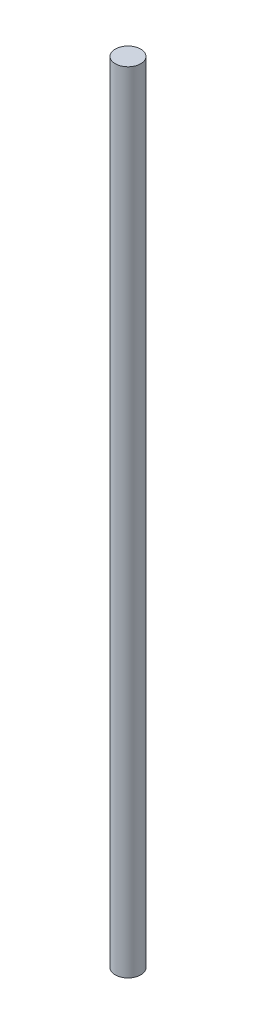
ISO-10303-21;
HEADER;
FILE_DESCRIPTION(('STEP AP214'),'2;1');
FILE_NAME('part.step','',(''),(''),'','','');
FILE_SCHEMA(('AUTOMOTIVE_DESIGN { 1 0 10303 214 1 1 1 1 }'));
ENDSEC;
DATA;
#1=APPLICATION_CONTEXT('core data for automotive mechanical design processes');
#2=APPLICATION_PROTOCOL_DEFINITION('international standard','automotive_design',2000,#1);
#3=PRODUCT_CONTEXT('',#1,'mechanical');
#4=PRODUCT('Part','Part','',(#3));
#5=PRODUCT_RELATED_PRODUCT_CATEGORY('part','',(#4));
#6=PRODUCT_DEFINITION_FORMATION('','',#4);
#7=PRODUCT_DEFINITION_CONTEXT('part definition',#1,'design');
#8=PRODUCT_DEFINITION('design','',#6,#7);
#9=PRODUCT_DEFINITION_SHAPE('','',#8);
#10=(LENGTH_UNIT() NAMED_UNIT(*) SI_UNIT(.MILLI.,.METRE.));
#11=(NAMED_UNIT(*) PLANE_ANGLE_UNIT() SI_UNIT($,.RADIAN.));
#12=(NAMED_UNIT(*) SI_UNIT($,.STERADIAN.) SOLID_ANGLE_UNIT());
#13=UNCERTAINTY_MEASURE_WITH_UNIT(LENGTH_MEASURE(1.E-05),#10,'distance_accuracy_value','');
#14=(GEOMETRIC_REPRESENTATION_CONTEXT(3) GLOBAL_UNCERTAINTY_ASSIGNED_CONTEXT((#13)) GLOBAL_UNIT_ASSIGNED_CONTEXT((#10,
#11,#12)) REPRESENTATION_CONTEXT('',''));
#15=CARTESIAN_POINT('',(0.,0.,0.));
#16=DIRECTION('',(0.,0.,1.));
#17=DIRECTION('',(1.,0.,0.));
#18=AXIS2_PLACEMENT_3D('',#15,#16,#17);
#19=CARTESIAN_POINT('',(0.,62.,0.));
#20=DIRECTION('',(0.,-1.,0.));
#21=DIRECTION('',(0.,0.,-1.));
#22=AXIS2_PLACEMENT_3D('',#19,#20,#21);
#23=CYLINDRICAL_SURFACE('',#22,1.);
#24=CARTESIAN_POINT('',(0.,62.,0.));
#25=DIRECTION('',(0.,1.,0.));
#26=DIRECTION('',(0.,0.,1.));
#27=AXIS2_PLACEMENT_3D('',#24,#25,#26);
#28=CIRCLE('',#27,1.);
#29=CARTESIAN_POINT('',(0.,62.,1.));
#30=VERTEX_POINT('',#29);
#31=EDGE_CURVE('E10',#30,#30,#28,.T.);
#32=ORIENTED_EDGE('',*,*,#31,.F.);
#33=EDGE_LOOP('',(#32));
#34=FACE_BOUND('',#33,.T.);
#35=CARTESIAN_POINT('',(0.,0.,0.));
#36=DIRECTION('',(0.,1.,0.));
#37=DIRECTION('',(0.,0.,1.));
#38=AXIS2_PLACEMENT_3D('',#35,#36,#37);
#39=CIRCLE('',#38,1.);
#40=CARTESIAN_POINT('',(0.,0.,1.));
#41=VERTEX_POINT('',#40);
#42=EDGE_CURVE('E42',#41,#41,#39,.T.);
#43=ORIENTED_EDGE('',*,*,#42,.T.);
#44=EDGE_LOOP('',(#43));
#45=FACE_BOUND('',#44,.T.);
#46=ADVANCED_FACE('F39',(#34,#45),#23,.T.);
#47=CARTESIAN_POINT('',(0.,62.,0.));
#48=DIRECTION('',(0.,1.,0.));
#49=DIRECTION('',(0.,0.,1.));
#50=AXIS2_PLACEMENT_3D('',#47,#48,#49);
#51=PLANE('',#50);
#52=ORIENTED_EDGE('',*,*,#31,.T.);
#53=EDGE_LOOP('',(#52));
#54=FACE_BOUND('',#53,.T.);
#55=ADVANCED_FACE('F54',(#54),#51,.T.);
#56=CARTESIAN_POINT('',(0.,0.,0.));
#57=DIRECTION('',(0.,1.,0.));
#58=DIRECTION('',(0.,0.,1.));
#59=AXIS2_PLACEMENT_3D('',#56,#57,#58);
#60=PLANE('',#59);
#61=ORIENTED_EDGE('',*,*,#42,.F.);
#62=EDGE_LOOP('',(#61));
#63=FACE_BOUND('',#62,.T.);
#64=ADVANCED_FACE('F52',(#63),#60,.F.);
#65=CLOSED_SHELL('',(#46,#55,#64));
#66=MANIFOLD_SOLID_BREP('B2',#65);
#67=ADVANCED_BREP_SHAPE_REPRESENTATION('',(#18,#66),#14);
#68=SHAPE_DEFINITION_REPRESENTATION(#9,#67);
ENDSEC;
END-ISO-10303-21;
